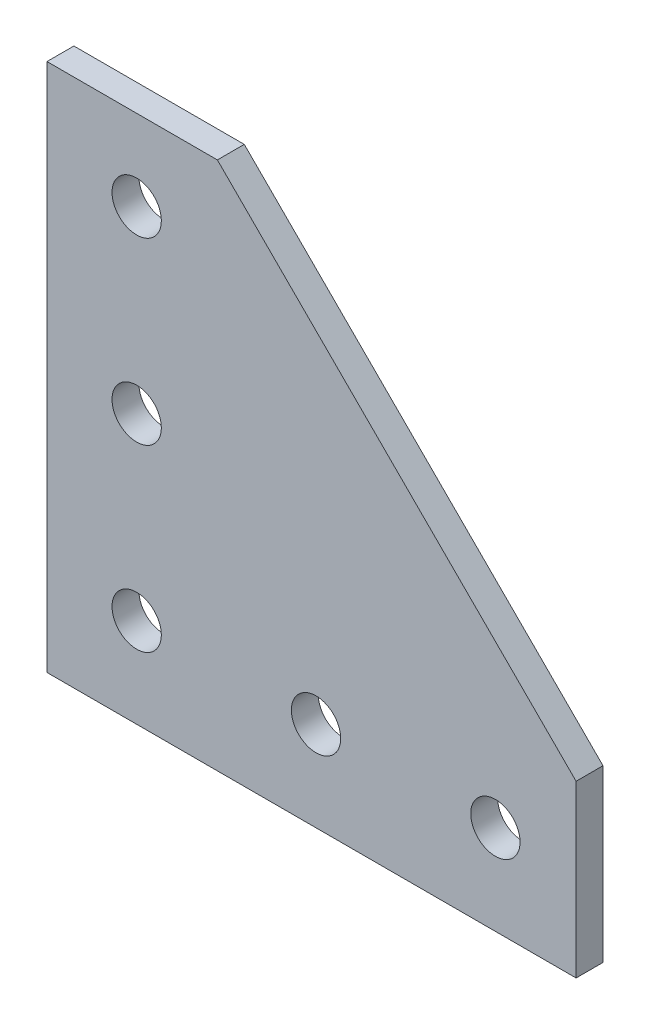
ISO-10303-21;
HEADER;
FILE_DESCRIPTION(('STEP AP214'),'2;1');
FILE_NAME('part.step','',(''),(''),'','','');
FILE_SCHEMA(('AUTOMOTIVE_DESIGN { 1 0 10303 214 1 1 1 1 }'));
ENDSEC;
DATA;
#1=APPLICATION_CONTEXT('core data for automotive mechanical design processes');
#2=APPLICATION_PROTOCOL_DEFINITION('international standard','automotive_design',2000,#1);
#3=PRODUCT_CONTEXT('',#1,'mechanical');
#4=PRODUCT('Part','Part','',(#3));
#5=PRODUCT_RELATED_PRODUCT_CATEGORY('part','',(#4));
#6=PRODUCT_DEFINITION_FORMATION('','',#4);
#7=PRODUCT_DEFINITION_CONTEXT('part definition',#1,'design');
#8=PRODUCT_DEFINITION('design','',#6,#7);
#9=PRODUCT_DEFINITION_SHAPE('','',#8);
#10=(LENGTH_UNIT() NAMED_UNIT(*) SI_UNIT(.MILLI.,.METRE.));
#11=(NAMED_UNIT(*) PLANE_ANGLE_UNIT() SI_UNIT($,.RADIAN.));
#12=(NAMED_UNIT(*) SI_UNIT($,.STERADIAN.) SOLID_ANGLE_UNIT());
#13=UNCERTAINTY_MEASURE_WITH_UNIT(LENGTH_MEASURE(1.E-05),#10,'distance_accuracy_value','');
#14=(GEOMETRIC_REPRESENTATION_CONTEXT(3) GLOBAL_UNCERTAINTY_ASSIGNED_CONTEXT((#13)) GLOBAL_UNIT_ASSIGNED_CONTEXT((#10,
#11,#12)) REPRESENTATION_CONTEXT('',''));
#15=CARTESIAN_POINT('',(0.,0.,0.));
#16=DIRECTION('',(0.,0.,1.));
#17=DIRECTION('',(1.,0.,0.));
#18=AXIS2_PLACEMENT_3D('',#15,#16,#17);
#19=CARTESIAN_POINT('',(0.,0.,3.));
#20=DIRECTION('',(1.,0.,0.));
#21=DIRECTION('',(0.,0.,-1.));
#22=AXIS2_PLACEMENT_3D('',#19,#20,#21);
#23=PLANE('',#22);
#24=DIRECTION('',(0.,-1.,0.));
#25=VECTOR('',#24,1.);
#26=CARTESIAN_POINT('',(0.,0.,0.));
#27=LINE('',#26,#25);
#28=CARTESIAN_POINT('',(0.,59.,0.));
#29=VERTEX_POINT('',#28);
#30=CARTESIAN_POINT('',(0.,0.,0.));
#31=VERTEX_POINT('',#30);
#32=EDGE_CURVE('E111',#29,#31,#27,.T.);
#33=ORIENTED_EDGE('',*,*,#32,.T.);
#34=DIRECTION('',(0.,0.,-1.));
#35=VECTOR('',#34,1.);
#36=CARTESIAN_POINT('',(0.,0.,3.));
#37=LINE('',#36,#35);
#38=CARTESIAN_POINT('',(0.,0.,3.));
#39=VERTEX_POINT('',#38);
#40=EDGE_CURVE('E91',#39,#31,#37,.T.);
#41=ORIENTED_EDGE('',*,*,#40,.F.);
#42=DIRECTION('',(0.,-1.,0.));
#43=VECTOR('',#42,1.);
#44=CARTESIAN_POINT('',(0.,0.,3.));
#45=LINE('',#44,#43);
#46=CARTESIAN_POINT('',(0.,59.,3.));
#47=VERTEX_POINT('',#46);
#48=EDGE_CURVE('E98',#47,#39,#45,.T.);
#49=ORIENTED_EDGE('',*,*,#48,.F.);
#50=DIRECTION('',(0.,0.,-1.));
#51=VECTOR('',#50,1.);
#52=CARTESIAN_POINT('',(0.,59.,3.));
#53=LINE('',#52,#51);
#54=EDGE_CURVE('E119',#47,#29,#53,.T.);
#55=ORIENTED_EDGE('',*,*,#54,.T.);
#56=EDGE_LOOP('',(#33,#41,#49,#55));
#57=FACE_BOUND('',#56,.T.);
#58=ADVANCED_FACE('F39',(#57),#23,.F.);
#59=CARTESIAN_POINT('',(0.,0.,3.));
#60=DIRECTION('',(0.,1.,0.));
#61=DIRECTION('',(0.,0.,1.));
#62=AXIS2_PLACEMENT_3D('',#59,#60,#61);
#63=PLANE('',#62);
#64=DIRECTION('',(1.,0.,0.));
#65=VECTOR('',#64,1.);
#66=CARTESIAN_POINT('',(0.,0.,0.));
#67=LINE('',#66,#65);
#68=CARTESIAN_POINT('',(59.,0.,0.));
#69=VERTEX_POINT('',#68);
#70=EDGE_CURVE('E132',#31,#69,#67,.T.);
#71=ORIENTED_EDGE('',*,*,#70,.T.);
#72=DIRECTION('',(0.,0.,-1.));
#73=VECTOR('',#72,1.);
#74=CARTESIAN_POINT('',(59.,0.,3.));
#75=LINE('',#74,#73);
#76=CARTESIAN_POINT('',(59.,0.,3.));
#77=VERTEX_POINT('',#76);
#78=EDGE_CURVE('E94',#77,#69,#75,.T.);
#79=ORIENTED_EDGE('',*,*,#78,.F.);
#80=DIRECTION('',(1.,0.,0.));
#81=VECTOR('',#80,1.);
#82=CARTESIAN_POINT('',(0.,0.,3.));
#83=LINE('',#82,#81);
#84=EDGE_CURVE('E87',#39,#77,#83,.T.);
#85=ORIENTED_EDGE('',*,*,#84,.F.);
#86=ORIENTED_EDGE('',*,*,#40,.T.);
#87=EDGE_LOOP('',(#71,#79,#85,#86));
#88=FACE_BOUND('',#87,.T.);
#89=ADVANCED_FACE('F89',(#88),#63,.F.);
#90=CARTESIAN_POINT('',(59.,0.,3.));
#91=DIRECTION('',(-1.,0.,0.));
#92=DIRECTION('',(0.,0.,1.));
#93=AXIS2_PLACEMENT_3D('',#90,#91,#92);
#94=PLANE('',#93);
#95=DIRECTION('',(0.,1.,0.));
#96=VECTOR('',#95,1.);
#97=CARTESIAN_POINT('',(59.,0.,0.));
#98=LINE('',#97,#96);
#99=CARTESIAN_POINT('',(59.,18.9999999999999,0.));
#100=VERTEX_POINT('',#99);
#101=EDGE_CURVE('E129',#69,#100,#98,.T.);
#102=ORIENTED_EDGE('',*,*,#101,.T.);
#103=DIRECTION('',(0.,0.,1.));
#104=VECTOR('',#103,1.);
#105=CARTESIAN_POINT('',(59.,18.9999999999999,3.));
#106=LINE('',#105,#104);
#107=CARTESIAN_POINT('',(59.,18.9999999999999,3.));
#108=VERTEX_POINT('',#107);
#109=EDGE_CURVE('E48',#100,#108,#106,.T.);
#110=ORIENTED_EDGE('',*,*,#109,.T.);
#111=DIRECTION('',(0.,1.,0.));
#112=VECTOR('',#111,1.);
#113=CARTESIAN_POINT('',(59.,0.,3.));
#114=LINE('',#113,#112);
#115=EDGE_CURVE('E97',#77,#108,#114,.T.);
#116=ORIENTED_EDGE('',*,*,#115,.F.);
#117=ORIENTED_EDGE('',*,*,#78,.T.);
#118=EDGE_LOOP('',(#102,#110,#116,#117));
#119=FACE_BOUND('',#118,.T.);
#120=ADVANCED_FACE('F216',(#119),#94,.F.);
#121=CARTESIAN_POINT('',(0.,59.,3.));
#122=DIRECTION('',(0.,-1.,0.));
#123=DIRECTION('',(0.,0.,-1.));
#124=AXIS2_PLACEMENT_3D('',#121,#122,#123);
#125=PLANE('',#124);
#126=DIRECTION('',(-1.,0.,0.));
#127=VECTOR('',#126,1.);
#128=CARTESIAN_POINT('',(0.,59.,3.));
#129=LINE('',#128,#127);
#130=CARTESIAN_POINT('',(19.,59.,3.));
#131=VERTEX_POINT('',#130);
#132=EDGE_CURVE('E103',#131,#47,#129,.T.);
#133=ORIENTED_EDGE('',*,*,#132,.F.);
#134=DIRECTION('',(0.,0.,-1.));
#135=VECTOR('',#134,1.);
#136=CARTESIAN_POINT('',(19.,59.,3.));
#137=LINE('',#136,#135);
#138=CARTESIAN_POINT('',(19.,59.,0.));
#139=VERTEX_POINT('',#138);
#140=EDGE_CURVE('E113',#131,#139,#137,.T.);
#141=ORIENTED_EDGE('',*,*,#140,.T.);
#142=DIRECTION('',(-1.,0.,0.));
#143=VECTOR('',#142,1.);
#144=CARTESIAN_POINT('',(0.,59.,0.));
#145=LINE('',#144,#143);
#146=EDGE_CURVE('E108',#139,#29,#145,.T.);
#147=ORIENTED_EDGE('',*,*,#146,.T.);
#148=ORIENTED_EDGE('',*,*,#54,.F.);
#149=EDGE_LOOP('',(#133,#141,#147,#148));
#150=FACE_BOUND('',#149,.T.);
#151=ADVANCED_FACE('F187',(#150),#125,.F.);
#152=CARTESIAN_POINT('',(0.,0.,3.));
#153=DIRECTION('',(0.,0.,-1.));
#154=DIRECTION('',(-1.,0.,0.));
#155=AXIS2_PLACEMENT_3D('',#152,#153,#154);
#156=PLANE('',#155);
#157=CARTESIAN_POINT('',(10.,10.,3.));
#158=DIRECTION('',(0.,0.,1.));
#159=DIRECTION('',(1.,0.,0.));
#160=AXIS2_PLACEMENT_3D('',#157,#158,#159);
#161=CIRCLE('',#160,2.75);
#162=CARTESIAN_POINT('',(12.75,10.,3.));
#163=VERTEX_POINT('',#162);
#164=EDGE_CURVE('E177',#163,#163,#161,.T.);
#165=ORIENTED_EDGE('',*,*,#164,.F.);
#166=EDGE_LOOP('',(#165));
#167=FACE_BOUND('',#166,.T.);
#168=CARTESIAN_POINT('',(10.,30.,3.));
#169=DIRECTION('',(0.,0.,1.));
#170=DIRECTION('',(1.,0.,0.));
#171=AXIS2_PLACEMENT_3D('',#168,#169,#170);
#172=CIRCLE('',#171,2.75);
#173=CARTESIAN_POINT('',(12.75,30.,3.));
#174=VERTEX_POINT('',#173);
#175=EDGE_CURVE('E169',#174,#174,#172,.T.);
#176=ORIENTED_EDGE('',*,*,#175,.F.);
#177=EDGE_LOOP('',(#176));
#178=FACE_BOUND('',#177,.T.);
#179=CARTESIAN_POINT('',(30.,10.,3.));
#180=DIRECTION('',(0.,0.,1.));
#181=DIRECTION('',(1.,0.,0.));
#182=AXIS2_PLACEMENT_3D('',#179,#180,#181);
#183=CIRCLE('',#182,2.75);
#184=CARTESIAN_POINT('',(32.75,10.,3.));
#185=VERTEX_POINT('',#184);
#186=EDGE_CURVE('E161',#185,#185,#183,.T.);
#187=ORIENTED_EDGE('',*,*,#186,.F.);
#188=EDGE_LOOP('',(#187));
#189=FACE_BOUND('',#188,.T.);
#190=CARTESIAN_POINT('',(50.,10.,3.));
#191=DIRECTION('',(0.,0.,1.));
#192=DIRECTION('',(1.,0.,0.));
#193=AXIS2_PLACEMENT_3D('',#190,#191,#192);
#194=CIRCLE('',#193,2.75);
#195=CARTESIAN_POINT('',(52.75,10.,3.));
#196=VERTEX_POINT('',#195);
#197=EDGE_CURVE('E153',#196,#196,#194,.T.);
#198=ORIENTED_EDGE('',*,*,#197,.F.);
#199=EDGE_LOOP('',(#198));
#200=FACE_BOUND('',#199,.T.);
#201=CARTESIAN_POINT('',(10.,50.,3.));
#202=DIRECTION('',(0.,0.,1.));
#203=DIRECTION('',(1.,0.,0.));
#204=AXIS2_PLACEMENT_3D('',#201,#202,#203);
#205=CIRCLE('',#204,2.75);
#206=CARTESIAN_POINT('',(12.75,50.,3.));
#207=VERTEX_POINT('',#206);
#208=EDGE_CURVE('E145',#207,#207,#205,.T.);
#209=ORIENTED_EDGE('',*,*,#208,.F.);
#210=EDGE_LOOP('',(#209));
#211=FACE_BOUND('',#210,.T.);
#212=ORIENTED_EDGE('',*,*,#115,.T.);
#213=DIRECTION('',(0.707106781186546,-0.707106781186549,0.));
#214=VECTOR('',#213,1.);
#215=CARTESIAN_POINT('',(19.,59.,3.));
#216=LINE('',#215,#214);
#217=EDGE_CURVE('E11',#108,#131,#216,.F.);
#218=ORIENTED_EDGE('',*,*,#217,.T.);
#219=ORIENTED_EDGE('',*,*,#132,.T.);
#220=ORIENTED_EDGE('',*,*,#48,.T.);
#221=ORIENTED_EDGE('',*,*,#84,.T.);
#222=EDGE_LOOP('',(#212,#218,#219,#220,#221));
#223=FACE_BOUND('',#222,.T.);
#224=ADVANCED_FACE('F101',(#167,#178,#189,#200,#211,#223),#156,.F.);
#225=CARTESIAN_POINT('',(0.,0.,0.));
#226=DIRECTION('',(0.,0.,-1.));
#227=DIRECTION('',(-1.,0.,0.));
#228=AXIS2_PLACEMENT_3D('',#225,#226,#227);
#229=PLANE('',#228);
#230=CARTESIAN_POINT('',(10.,10.,0.));
#231=DIRECTION('',(0.,0.,1.));
#232=DIRECTION('',(1.,0.,0.));
#233=AXIS2_PLACEMENT_3D('',#230,#231,#232);
#234=CIRCLE('',#233,2.75);
#235=CARTESIAN_POINT('',(12.75,10.,0.));
#236=VERTEX_POINT('',#235);
#237=EDGE_CURVE('E173',#236,#236,#234,.T.);
#238=ORIENTED_EDGE('',*,*,#237,.T.);
#239=EDGE_LOOP('',(#238));
#240=FACE_BOUND('',#239,.T.);
#241=CARTESIAN_POINT('',(10.,30.,0.));
#242=DIRECTION('',(0.,0.,1.));
#243=DIRECTION('',(1.,0.,0.));
#244=AXIS2_PLACEMENT_3D('',#241,#242,#243);
#245=CIRCLE('',#244,2.75);
#246=CARTESIAN_POINT('',(12.75,30.,0.));
#247=VERTEX_POINT('',#246);
#248=EDGE_CURVE('E165',#247,#247,#245,.T.);
#249=ORIENTED_EDGE('',*,*,#248,.T.);
#250=EDGE_LOOP('',(#249));
#251=FACE_BOUND('',#250,.T.);
#252=CARTESIAN_POINT('',(30.,10.,0.));
#253=DIRECTION('',(0.,0.,1.));
#254=DIRECTION('',(1.,0.,0.));
#255=AXIS2_PLACEMENT_3D('',#252,#253,#254);
#256=CIRCLE('',#255,2.75);
#257=CARTESIAN_POINT('',(32.75,10.,0.));
#258=VERTEX_POINT('',#257);
#259=EDGE_CURVE('E157',#258,#258,#256,.T.);
#260=ORIENTED_EDGE('',*,*,#259,.T.);
#261=EDGE_LOOP('',(#260));
#262=FACE_BOUND('',#261,.T.);
#263=CARTESIAN_POINT('',(50.,10.,0.));
#264=DIRECTION('',(0.,0.,1.));
#265=DIRECTION('',(1.,0.,0.));
#266=AXIS2_PLACEMENT_3D('',#263,#264,#265);
#267=CIRCLE('',#266,2.75);
#268=CARTESIAN_POINT('',(52.75,10.,0.));
#269=VERTEX_POINT('',#268);
#270=EDGE_CURVE('E149',#269,#269,#267,.T.);
#271=ORIENTED_EDGE('',*,*,#270,.T.);
#272=EDGE_LOOP('',(#271));
#273=FACE_BOUND('',#272,.T.);
#274=CARTESIAN_POINT('',(10.,50.,0.));
#275=DIRECTION('',(0.,0.,1.));
#276=DIRECTION('',(1.,0.,0.));
#277=AXIS2_PLACEMENT_3D('',#274,#275,#276);
#278=CIRCLE('',#277,2.75);
#279=CARTESIAN_POINT('',(12.75,50.,0.));
#280=VERTEX_POINT('',#279);
#281=EDGE_CURVE('E137',#280,#280,#278,.T.);
#282=ORIENTED_EDGE('',*,*,#281,.T.);
#283=EDGE_LOOP('',(#282));
#284=FACE_BOUND('',#283,.T.);
#285=ORIENTED_EDGE('',*,*,#146,.F.);
#286=DIRECTION('',(-0.707106781186546,0.707106781186549,0.));
#287=VECTOR('',#286,1.);
#288=CARTESIAN_POINT('',(39.,38.9999999999999,0.));
#289=LINE('',#288,#287);
#290=EDGE_CURVE('E62',#139,#100,#289,.F.);
#291=ORIENTED_EDGE('',*,*,#290,.T.);
#292=ORIENTED_EDGE('',*,*,#101,.F.);
#293=ORIENTED_EDGE('',*,*,#70,.F.);
#294=ORIENTED_EDGE('',*,*,#32,.F.);
#295=EDGE_LOOP('',(#285,#291,#292,#293,#294));
#296=FACE_BOUND('',#295,.T.);
#297=ADVANCED_FACE('F186',(#240,#251,#262,#273,#284,#296),#229,.T.);
#298=CARTESIAN_POINT('',(10.,50.,3.));
#299=DIRECTION('',(0.,0.,1.));
#300=DIRECTION('',(1.,0.,0.));
#301=AXIS2_PLACEMENT_3D('',#298,#299,#300);
#302=CYLINDRICAL_SURFACE('',#301,2.75);
#303=ORIENTED_EDGE('',*,*,#281,.F.);
#304=EDGE_LOOP('',(#303));
#305=FACE_BOUND('',#304,.T.);
#306=ORIENTED_EDGE('',*,*,#208,.T.);
#307=EDGE_LOOP('',(#306));
#308=FACE_BOUND('',#307,.T.);
#309=ADVANCED_FACE('F197',(#305,#308),#302,.F.);
#310=CARTESIAN_POINT('',(50.,10.,3.));
#311=DIRECTION('',(0.,0.,1.));
#312=DIRECTION('',(1.,0.,0.));
#313=AXIS2_PLACEMENT_3D('',#310,#311,#312);
#314=CYLINDRICAL_SURFACE('',#313,2.75);
#315=ORIENTED_EDGE('',*,*,#270,.F.);
#316=EDGE_LOOP('',(#315));
#317=FACE_BOUND('',#316,.T.);
#318=ORIENTED_EDGE('',*,*,#197,.T.);
#319=EDGE_LOOP('',(#318));
#320=FACE_BOUND('',#319,.T.);
#321=ADVANCED_FACE('F199',(#317,#320),#314,.F.);
#322=CARTESIAN_POINT('',(30.,10.,3.));
#323=DIRECTION('',(0.,0.,1.));
#324=DIRECTION('',(1.,0.,0.));
#325=AXIS2_PLACEMENT_3D('',#322,#323,#324);
#326=CYLINDRICAL_SURFACE('',#325,2.75);
#327=ORIENTED_EDGE('',*,*,#259,.F.);
#328=EDGE_LOOP('',(#327));
#329=FACE_BOUND('',#328,.T.);
#330=ORIENTED_EDGE('',*,*,#186,.T.);
#331=EDGE_LOOP('',(#330));
#332=FACE_BOUND('',#331,.T.);
#333=ADVANCED_FACE('F206',(#329,#332),#326,.F.);
#334=CARTESIAN_POINT('',(10.,30.,3.));
#335=DIRECTION('',(0.,0.,1.));
#336=DIRECTION('',(1.,0.,0.));
#337=AXIS2_PLACEMENT_3D('',#334,#335,#336);
#338=CYLINDRICAL_SURFACE('',#337,2.75);
#339=ORIENTED_EDGE('',*,*,#248,.F.);
#340=EDGE_LOOP('',(#339));
#341=FACE_BOUND('',#340,.T.);
#342=ORIENTED_EDGE('',*,*,#175,.T.);
#343=EDGE_LOOP('',(#342));
#344=FACE_BOUND('',#343,.T.);
#345=ADVANCED_FACE('F232',(#341,#344),#338,.F.);
#346=CARTESIAN_POINT('',(10.,10.,3.));
#347=DIRECTION('',(0.,0.,1.));
#348=DIRECTION('',(1.,0.,0.));
#349=AXIS2_PLACEMENT_3D('',#346,#347,#348);
#350=CYLINDRICAL_SURFACE('',#349,2.75);
#351=ORIENTED_EDGE('',*,*,#237,.F.);
#352=EDGE_LOOP('',(#351));
#353=FACE_BOUND('',#352,.T.);
#354=ORIENTED_EDGE('',*,*,#164,.T.);
#355=EDGE_LOOP('',(#354));
#356=FACE_BOUND('',#355,.T.);
#357=ADVANCED_FACE('F182',(#353,#356),#350,.F.);
#358=CARTESIAN_POINT('',(19.,59.,3.));
#359=DIRECTION('',(-0.707106781186549,-0.707106781186546,0.));
#360=DIRECTION('',(0.,0.,-1.));
#361=AXIS2_PLACEMENT_3D('',#358,#359,#360);
#362=PLANE('',#361);
#363=ORIENTED_EDGE('',*,*,#217,.F.);
#364=ORIENTED_EDGE('',*,*,#109,.F.);
#365=ORIENTED_EDGE('',*,*,#290,.F.);
#366=ORIENTED_EDGE('',*,*,#140,.F.);
#367=EDGE_LOOP('',(#363,#364,#365,#366));
#368=FACE_BOUND('',#367,.T.);
#369=ADVANCED_FACE('F41',(#368),#362,.F.);
#370=CLOSED_SHELL('',(#58,#89,#120,#151,#224,#297,#309,#321,#333,#345,#357,#369));
#371=MANIFOLD_SOLID_BREP('B2',#370);
#372=ADVANCED_BREP_SHAPE_REPRESENTATION('',(#18,#371),#14);
#373=SHAPE_DEFINITION_REPRESENTATION(#9,#372);
ENDSEC;
END-ISO-10303-21;
